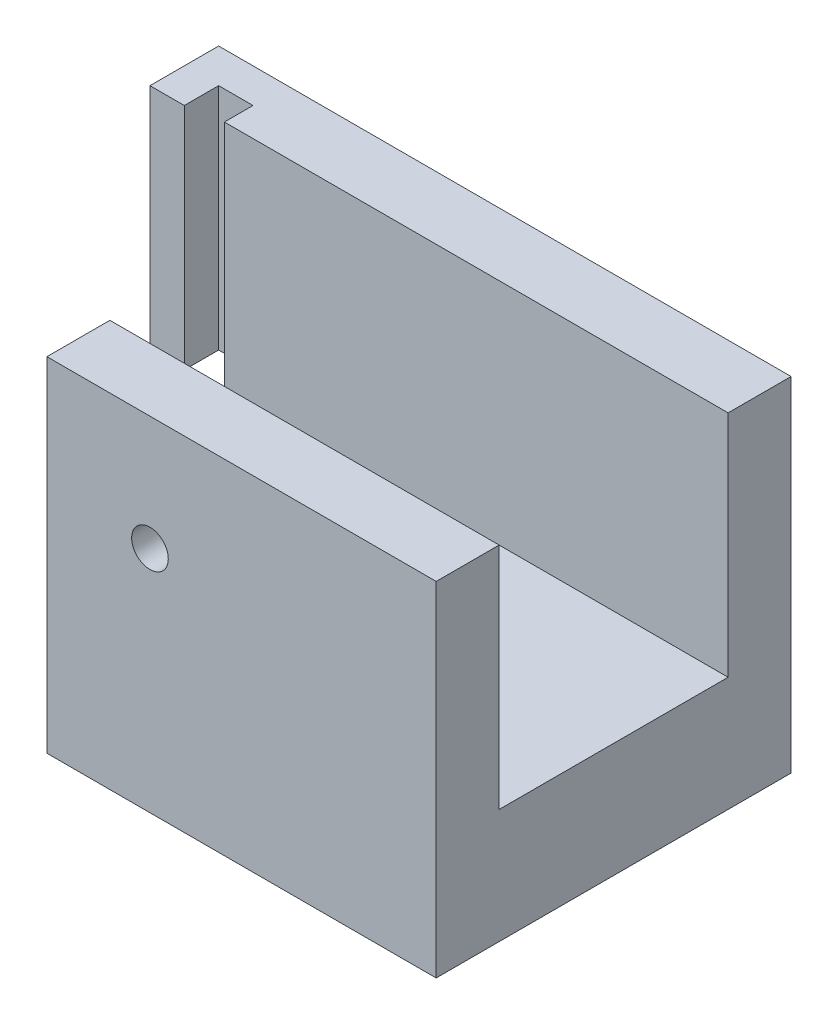
ISO-10303-21;
HEADER;
FILE_DESCRIPTION(('STEP AP214'),'2;1');
FILE_NAME('part.step','',(''),(''),'','','');
FILE_SCHEMA(('AUTOMOTIVE_DESIGN { 1 0 10303 214 1 1 1 1 }'));
ENDSEC;
DATA;
#1=APPLICATION_CONTEXT('core data for automotive mechanical design processes');
#2=APPLICATION_PROTOCOL_DEFINITION('international standard','automotive_design',2000,#1);
#3=PRODUCT_CONTEXT('',#1,'mechanical');
#4=PRODUCT('Part','Part','',(#3));
#5=PRODUCT_RELATED_PRODUCT_CATEGORY('part','',(#4));
#6=PRODUCT_DEFINITION_FORMATION('','',#4);
#7=PRODUCT_DEFINITION_CONTEXT('part definition',#1,'design');
#8=PRODUCT_DEFINITION('design','',#6,#7);
#9=PRODUCT_DEFINITION_SHAPE('','',#8);
#10=(LENGTH_UNIT() NAMED_UNIT(*) SI_UNIT(.MILLI.,.METRE.));
#11=(NAMED_UNIT(*) PLANE_ANGLE_UNIT() SI_UNIT($,.RADIAN.));
#12=(NAMED_UNIT(*) SI_UNIT($,.STERADIAN.) SOLID_ANGLE_UNIT());
#13=UNCERTAINTY_MEASURE_WITH_UNIT(LENGTH_MEASURE(1.E-05),#10,'distance_accuracy_value','');
#14=(GEOMETRIC_REPRESENTATION_CONTEXT(3) GLOBAL_UNCERTAINTY_ASSIGNED_CONTEXT((#13)) GLOBAL_UNIT_ASSIGNED_CONTEXT((#10,
#11,#12)) REPRESENTATION_CONTEXT('',''));
#15=CARTESIAN_POINT('',(0.,0.,0.));
#16=DIRECTION('',(0.,0.,1.));
#17=DIRECTION('',(1.,0.,0.));
#18=AXIS2_PLACEMENT_3D('',#15,#16,#17);
#19=CARTESIAN_POINT('',(0.,15.,-11.936414520975));
#20=DIRECTION('',(1.,0.,0.));
#21=DIRECTION('',(0.,0.,-1.));
#22=AXIS2_PLACEMENT_3D('',#19,#20,#21);
#23=PLANE('',#22);
#24=DIRECTION('',(0.,0.,1.));
#25=VECTOR('',#24,1.);
#26=CARTESIAN_POINT('',(0.,5.,-11.936414520975));
#27=LINE('',#26,#25);
#28=CARTESIAN_POINT('',(0.,5.,-11.936414520975));
#29=VERTEX_POINT('',#28);
#30=CARTESIAN_POINT('',(0.,5.,-8.93641452097499));
#31=VERTEX_POINT('',#30);
#32=EDGE_CURVE('E177',#29,#31,#27,.T.);
#33=ORIENTED_EDGE('',*,*,#32,.T.);
#34=DIRECTION('',(0.,-1.,0.));
#35=VECTOR('',#34,1.);
#36=CARTESIAN_POINT('',(0.,15.,-8.93641452097499));
#37=LINE('',#36,#35);
#38=CARTESIAN_POINT('',(0.,15.,-8.93641452097499));
#39=VERTEX_POINT('',#38);
#40=EDGE_CURVE('E53',#39,#31,#37,.T.);
#41=ORIENTED_EDGE('',*,*,#40,.F.);
#42=DIRECTION('',(0.,0.,1.));
#43=VECTOR('',#42,1.);
#44=CARTESIAN_POINT('',(0.,15.,-11.936414520975));
#45=LINE('',#44,#43);
#46=CARTESIAN_POINT('',(0.,15.,-11.936414520975));
#47=VERTEX_POINT('',#46);
#48=EDGE_CURVE('E229',#47,#39,#45,.T.);
#49=ORIENTED_EDGE('',*,*,#48,.F.);
#50=DIRECTION('',(0.,-1.,0.));
#51=VECTOR('',#50,1.);
#52=CARTESIAN_POINT('',(0.,15.,-11.936414520975));
#53=LINE('',#52,#51);
#54=EDGE_CURVE('E258',#47,#29,#53,.T.);
#55=ORIENTED_EDGE('',*,*,#54,.T.);
#56=EDGE_LOOP('',(#33,#41,#49,#55));
#57=FACE_BOUND('',#56,.T.);
#58=ADVANCED_FACE('F45',(#57),#23,.F.);
#59=CARTESIAN_POINT('',(0.,15.,-8.93641452097499));
#60=DIRECTION('',(0.,0.,-1.));
#61=DIRECTION('',(-1.,0.,0.));
#62=AXIS2_PLACEMENT_3D('',#59,#60,#61);
#63=PLANE('',#62);
#64=DIRECTION('',(-1.,0.,0.));
#65=VECTOR('',#64,1.);
#66=CARTESIAN_POINT('',(0.,5.,-8.93641452097499));
#67=LINE('',#66,#65);
#68=CARTESIAN_POINT('',(1.5,5.,-8.93641452097499));
#69=VERTEX_POINT('',#68);
#70=EDGE_CURVE('E193',#69,#31,#67,.T.);
#71=ORIENTED_EDGE('',*,*,#70,.F.);
#72=DIRECTION('',(0.,-1.,0.));
#73=VECTOR('',#72,1.);
#74=CARTESIAN_POINT('',(1.5,15.,-8.93641452097499));
#75=LINE('',#74,#73);
#76=CARTESIAN_POINT('',(1.5,15.,-8.93641452097499));
#77=VERTEX_POINT('',#76);
#78=EDGE_CURVE('E288',#77,#69,#75,.T.);
#79=ORIENTED_EDGE('',*,*,#78,.F.);
#80=DIRECTION('',(1.,0.,0.));
#81=VECTOR('',#80,1.);
#82=CARTESIAN_POINT('',(0.,15.,-8.93641452097499));
#83=LINE('',#82,#81);
#84=EDGE_CURVE('E233',#39,#77,#83,.T.);
#85=ORIENTED_EDGE('',*,*,#84,.F.);
#86=ORIENTED_EDGE('',*,*,#40,.T.);
#87=EDGE_LOOP('',(#71,#79,#85,#86));
#88=FACE_BOUND('',#87,.T.);
#89=ADVANCED_FACE('F296',(#88),#63,.F.);
#90=CARTESIAN_POINT('',(1.5,15.,-10.436414520975));
#91=DIRECTION('',(-1.,0.,0.));
#92=DIRECTION('',(0.,0.,1.));
#93=AXIS2_PLACEMENT_3D('',#90,#91,#92);
#94=PLANE('',#93);
#95=DIRECTION('',(0.,0.,1.));
#96=VECTOR('',#95,1.);
#97=CARTESIAN_POINT('',(1.5,5.,-10.436414520975));
#98=LINE('',#97,#96);
#99=CARTESIAN_POINT('',(1.5,5.,-10.436414520975));
#100=VERTEX_POINT('',#99);
#101=EDGE_CURVE('E190',#100,#69,#98,.T.);
#102=ORIENTED_EDGE('',*,*,#101,.F.);
#103=DIRECTION('',(0.,-1.,0.));
#104=VECTOR('',#103,1.);
#105=CARTESIAN_POINT('',(1.5,15.,-10.436414520975));
#106=LINE('',#105,#104);
#107=CARTESIAN_POINT('',(1.5,15.,-10.436414520975));
#108=VERTEX_POINT('',#107);
#109=EDGE_CURVE('E284',#108,#100,#106,.T.);
#110=ORIENTED_EDGE('',*,*,#109,.F.);
#111=DIRECTION('',(0.,0.,-1.));
#112=VECTOR('',#111,1.);
#113=CARTESIAN_POINT('',(1.5,15.,-10.436414520975));
#114=LINE('',#113,#112);
#115=EDGE_CURVE('E237',#77,#108,#114,.T.);
#116=ORIENTED_EDGE('',*,*,#115,.F.);
#117=ORIENTED_EDGE('',*,*,#78,.T.);
#118=EDGE_LOOP('',(#102,#110,#116,#117));
#119=FACE_BOUND('',#118,.T.);
#120=ADVANCED_FACE('F320',(#119),#94,.F.);
#121=CARTESIAN_POINT('',(1.5,15.,-10.436414520975));
#122=DIRECTION('',(0.,0.,-1.));
#123=DIRECTION('',(-1.,0.,0.));
#124=AXIS2_PLACEMENT_3D('',#121,#122,#123);
#125=PLANE('',#124);
#126=DIRECTION('',(-1.,0.,0.));
#127=VECTOR('',#126,1.);
#128=CARTESIAN_POINT('',(1.5,5.,-10.436414520975));
#129=LINE('',#128,#127);
#130=CARTESIAN_POINT('',(3.,5.,-10.436414520975));
#131=VERTEX_POINT('',#130);
#132=EDGE_CURVE('E187',#131,#100,#129,.T.);
#133=ORIENTED_EDGE('',*,*,#132,.F.);
#134=DIRECTION('',(0.,-1.,0.));
#135=VECTOR('',#134,1.);
#136=CARTESIAN_POINT('',(3.,15.,-10.436414520975));
#137=LINE('',#136,#135);
#138=CARTESIAN_POINT('',(3.,15.,-10.436414520975));
#139=VERTEX_POINT('',#138);
#140=EDGE_CURVE('E280',#139,#131,#137,.T.);
#141=ORIENTED_EDGE('',*,*,#140,.F.);
#142=DIRECTION('',(1.,0.,0.));
#143=VECTOR('',#142,1.);
#144=CARTESIAN_POINT('',(1.5,15.,-10.436414520975));
#145=LINE('',#144,#143);
#146=EDGE_CURVE('E240',#108,#139,#145,.T.);
#147=ORIENTED_EDGE('',*,*,#146,.F.);
#148=ORIENTED_EDGE('',*,*,#109,.T.);
#149=EDGE_LOOP('',(#133,#141,#147,#148));
#150=FACE_BOUND('',#149,.T.);
#151=ADVANCED_FACE('F315',(#150),#125,.F.);
#152=CARTESIAN_POINT('',(0.,15.,3.56358547902502));
#153=DIRECTION('',(0.,0.,-1.));
#154=DIRECTION('',(-1.,0.,0.));
#155=AXIS2_PLACEMENT_3D('',#152,#153,#154);
#156=PLANE('',#155);
#157=DIRECTION('',(1.,0.,0.));
#158=VECTOR('',#157,1.);
#159=CARTESIAN_POINT('',(0.,15.,3.56358547902502));
#160=LINE('',#159,#158);
#161=CARTESIAN_POINT('',(8.,15.,3.56358547902502));
#162=VERTEX_POINT('',#161);
#163=CARTESIAN_POINT('',(25.,15.,3.56358547902502));
#164=VERTEX_POINT('',#163);
#165=EDGE_CURVE('E247',#162,#164,#160,.T.);
#166=ORIENTED_EDGE('',*,*,#165,.F.);
#167=DIRECTION('',(0.,1.,0.));
#168=VECTOR('',#167,1.);
#169=CARTESIAN_POINT('',(8.,0.,3.56358547902502));
#170=LINE('',#169,#168);
#171=CARTESIAN_POINT('',(8.,0.,3.56358547902502));
#172=VERTEX_POINT('',#171);
#173=EDGE_CURVE('E161',#172,#162,#170,.T.);
#174=ORIENTED_EDGE('',*,*,#173,.F.);
#175=DIRECTION('',(1.,0.,0.));
#176=VECTOR('',#175,1.);
#177=CARTESIAN_POINT('',(0.,0.,3.56358547902502));
#178=LINE('',#177,#176);
#179=CARTESIAN_POINT('',(25.,0.,3.56358547902502));
#180=VERTEX_POINT('',#179);
#181=EDGE_CURVE('E166',#172,#180,#178,.T.);
#182=ORIENTED_EDGE('',*,*,#181,.T.);
#183=DIRECTION('',(0.,-1.,0.));
#184=VECTOR('',#183,1.);
#185=CARTESIAN_POINT('',(25.,15.,3.56358547902502));
#186=LINE('',#185,#184);
#187=EDGE_CURVE('E276',#164,#180,#186,.T.);
#188=ORIENTED_EDGE('',*,*,#187,.F.);
#189=EDGE_LOOP('',(#166,#174,#182,#188));
#190=FACE_BOUND('',#189,.T.);
#191=CARTESIAN_POINT('',(12.5,10.,3.56358547902502));
#192=DIRECTION('',(0.,0.,1.));
#193=DIRECTION('',(1.,0.,0.));
#194=AXIS2_PLACEMENT_3D('',#191,#192,#193);
#195=CIRCLE('',#194,0.799999999999988);
#196=CARTESIAN_POINT('',(13.3,10.,3.56358547902502));
#197=VERTEX_POINT('',#196);
#198=EDGE_CURVE('E196',#197,#197,#195,.T.);
#199=ORIENTED_EDGE('',*,*,#198,.F.);
#200=EDGE_LOOP('',(#199));
#201=FACE_BOUND('',#200,.T.);
#202=ADVANCED_FACE('F333',(#190,#201),#156,.F.);
#203=CARTESIAN_POINT('',(0.,15.,0.));
#204=DIRECTION('',(0.,1.,0.));
#205=DIRECTION('',(0.,0.,1.));
#206=AXIS2_PLACEMENT_3D('',#203,#204,#205);
#207=PLANE('',#206);
#208=DIRECTION('',(0.,0.,1.));
#209=VECTOR('',#208,1.);
#210=CARTESIAN_POINT('',(8.,15.,-24.9978028218169));
#211=LINE('',#210,#209);
#212=CARTESIAN_POINT('',(8.,15.,0.81358547902502));
#213=VERTEX_POINT('',#212);
#214=EDGE_CURVE('E154',#213,#162,#211,.T.);
#215=ORIENTED_EDGE('',*,*,#214,.T.);
#216=ORIENTED_EDGE('',*,*,#165,.T.);
#217=DIRECTION('',(0.,0.,-1.));
#218=VECTOR('',#217,1.);
#219=CARTESIAN_POINT('',(25.,15.,-11.936414520975));
#220=LINE('',#219,#218);
#221=CARTESIAN_POINT('',(25.,15.,0.813585479025009));
#222=VERTEX_POINT('',#221);
#223=EDGE_CURVE('E251',#164,#222,#220,.T.);
#224=ORIENTED_EDGE('',*,*,#223,.T.);
#225=DIRECTION('',(1.,0.,0.));
#226=VECTOR('',#225,1.);
#227=CARTESIAN_POINT('',(25.,15.,0.813585479025009));
#228=LINE('',#227,#226);
#229=EDGE_CURVE('E210',#213,#222,#228,.T.);
#230=ORIENTED_EDGE('',*,*,#229,.F.);
#231=EDGE_LOOP('',(#215,#216,#224,#230));
#232=FACE_BOUND('',#231,.T.);
#233=ADVANCED_FACE('F340',(#232),#207,.T.);
#234=CARTESIAN_POINT('',(3.,15.,-10.436414520975));
#235=DIRECTION('',(1.,0.,0.));
#236=DIRECTION('',(0.,0.,-1.));
#237=AXIS2_PLACEMENT_3D('',#234,#235,#236);
#238=PLANE('',#237);
#239=DIRECTION('',(0.,0.,1.));
#240=VECTOR('',#239,1.);
#241=CARTESIAN_POINT('',(3.,0.,-10.436414520975));
#242=LINE('',#241,#240);
#243=CARTESIAN_POINT('',(3.,0.,-11.936414520975));
#244=VERTEX_POINT('',#243);
#245=CARTESIAN_POINT('',(3.,0.,-9.18641452097499));
#246=VERTEX_POINT('',#245);
#247=EDGE_CURVE('E67',#244,#246,#242,.T.);
#248=ORIENTED_EDGE('',*,*,#247,.T.);
#249=DIRECTION('',(0.,1.,0.));
#250=VECTOR('',#249,1.);
#251=CARTESIAN_POINT('',(3.,5.,-9.18641452097499));
#252=LINE('',#251,#250);
#253=CARTESIAN_POINT('',(3.,15.,-9.18641452097499));
#254=VERTEX_POINT('',#253);
#255=EDGE_CURVE('E159',#246,#254,#252,.T.);
#256=ORIENTED_EDGE('',*,*,#255,.T.);
#257=DIRECTION('',(0.,0.,1.));
#258=VECTOR('',#257,1.);
#259=CARTESIAN_POINT('',(3.,15.,-10.436414520975));
#260=LINE('',#259,#258);
#261=EDGE_CURVE('E243',#139,#254,#260,.T.);
#262=ORIENTED_EDGE('',*,*,#261,.F.);
#263=ORIENTED_EDGE('',*,*,#140,.T.);
#264=DIRECTION('',(0.,0.,-1.));
#265=VECTOR('',#264,1.);
#266=CARTESIAN_POINT('',(3.,5.,-11.936414520975));
#267=LINE('',#266,#265);
#268=CARTESIAN_POINT('',(3.,5.,-11.936414520975));
#269=VERTEX_POINT('',#268);
#270=EDGE_CURVE('E174',#131,#269,#267,.T.);
#271=ORIENTED_EDGE('',*,*,#270,.T.);
#272=DIRECTION('',(0.,-1.,0.));
#273=VECTOR('',#272,1.);
#274=CARTESIAN_POINT('',(3.,20.7876534038469,-11.936414520975));
#275=LINE('',#274,#273);
#276=EDGE_CURVE('E173',#269,#244,#275,.T.);
#277=ORIENTED_EDGE('',*,*,#276,.T.);
#278=EDGE_LOOP('',(#248,#256,#262,#263,#271,#277));
#279=FACE_BOUND('',#278,.T.);
#280=ADVANCED_FACE('F309',(#279),#238,.F.);
#281=CARTESIAN_POINT('',(25.,15.,-11.936414520975));
#282=DIRECTION('',(-1.,0.,0.));
#283=DIRECTION('',(0.,0.,1.));
#284=AXIS2_PLACEMENT_3D('',#281,#282,#283);
#285=PLANE('',#284);
#286=DIRECTION('',(0.,0.,-1.));
#287=VECTOR('',#286,1.);
#288=CARTESIAN_POINT('',(25.,5.,-9.18641452097499));
#289=LINE('',#288,#287);
#290=CARTESIAN_POINT('',(25.,5.,0.813585479025009));
#291=VERTEX_POINT('',#290);
#292=CARTESIAN_POINT('',(25.,5.,-9.18641452097499));
#293=VERTEX_POINT('',#292);
#294=EDGE_CURVE('E205',#291,#293,#289,.T.);
#295=ORIENTED_EDGE('',*,*,#294,.F.);
#296=DIRECTION('',(0.,1.,0.));
#297=VECTOR('',#296,1.);
#298=CARTESIAN_POINT('',(25.,5.,0.813585479025009));
#299=LINE('',#298,#297);
#300=EDGE_CURVE('E221',#291,#222,#299,.T.);
#301=ORIENTED_EDGE('',*,*,#300,.T.);
#302=ORIENTED_EDGE('',*,*,#223,.F.);
#303=ORIENTED_EDGE('',*,*,#187,.T.);
#304=DIRECTION('',(0.,0.,-1.));
#305=VECTOR('',#304,1.);
#306=CARTESIAN_POINT('',(25.,0.,-11.936414520975));
#307=LINE('',#306,#305);
#308=CARTESIAN_POINT('',(25.,0.,-11.936414520975));
#309=VERTEX_POINT('',#308);
#310=EDGE_CURVE('E263',#180,#309,#307,.T.);
#311=ORIENTED_EDGE('',*,*,#310,.T.);
#312=DIRECTION('',(0.,-1.,0.));
#313=VECTOR('',#312,1.);
#314=CARTESIAN_POINT('',(25.,15.,-11.936414520975));
#315=LINE('',#314,#313);
#316=CARTESIAN_POINT('',(25.,15.,-11.936414520975));
#317=VERTEX_POINT('',#316);
#318=EDGE_CURVE('E272',#317,#309,#315,.T.);
#319=ORIENTED_EDGE('',*,*,#318,.F.);
#320=CARTESIAN_POINT('',(25.,15.,-9.18641452097499));
#321=VERTEX_POINT('',#320);
#322=EDGE_CURVE('E250',#321,#317,#220,.T.);
#323=ORIENTED_EDGE('',*,*,#322,.F.);
#324=DIRECTION('',(0.,1.,0.));
#325=VECTOR('',#324,1.);
#326=CARTESIAN_POINT('',(25.,5.,-9.18641452097499));
#327=LINE('',#326,#325);
#328=EDGE_CURVE('E216',#293,#321,#327,.T.);
#329=ORIENTED_EDGE('',*,*,#328,.F.);
#330=EDGE_LOOP('',(#295,#301,#302,#303,#311,#319,#323,#329));
#331=FACE_BOUND('',#330,.T.);
#332=ADVANCED_FACE('F328',(#331),#285,.F.);
#333=CARTESIAN_POINT('',(0.,15.,-11.936414520975));
#334=DIRECTION('',(0.,0.,1.));
#335=DIRECTION('',(1.,0.,0.));
#336=AXIS2_PLACEMENT_3D('',#333,#334,#335);
#337=PLANE('',#336);
#338=DIRECTION('',(-1.,0.,0.));
#339=VECTOR('',#338,1.);
#340=CARTESIAN_POINT('',(0.,0.,-11.936414520975));
#341=LINE('',#340,#339);
#342=EDGE_CURVE('E234',#309,#244,#341,.T.);
#343=ORIENTED_EDGE('',*,*,#342,.T.);
#344=ORIENTED_EDGE('',*,*,#276,.F.);
#345=DIRECTION('',(-1.,0.,0.));
#346=VECTOR('',#345,1.);
#347=CARTESIAN_POINT('',(0.,5.,-11.936414520975));
#348=LINE('',#347,#346);
#349=EDGE_CURVE('E181',#269,#29,#348,.T.);
#350=ORIENTED_EDGE('',*,*,#349,.T.);
#351=ORIENTED_EDGE('',*,*,#54,.F.);
#352=DIRECTION('',(-1.,0.,0.));
#353=VECTOR('',#352,1.);
#354=CARTESIAN_POINT('',(0.,15.,-11.936414520975));
#355=LINE('',#354,#353);
#356=EDGE_CURVE('E255',#317,#47,#355,.T.);
#357=ORIENTED_EDGE('',*,*,#356,.F.);
#358=ORIENTED_EDGE('',*,*,#318,.T.);
#359=EDGE_LOOP('',(#343,#344,#350,#351,#357,#358));
#360=FACE_BOUND('',#359,.T.);
#361=ADVANCED_FACE('F306',(#360),#337,.F.);
#362=DIRECTION('',(-1.,0.,0.));
#363=VECTOR('',#362,1.);
#364=CARTESIAN_POINT('',(25.,15.,-9.18641452097499));
#365=LINE('',#364,#363);
#366=EDGE_CURVE('E204',#321,#254,#365,.T.);
#367=ORIENTED_EDGE('',*,*,#366,.F.);
#368=ORIENTED_EDGE('',*,*,#322,.T.);
#369=ORIENTED_EDGE('',*,*,#356,.T.);
#370=ORIENTED_EDGE('',*,*,#48,.T.);
#371=ORIENTED_EDGE('',*,*,#84,.T.);
#372=ORIENTED_EDGE('',*,*,#115,.T.);
#373=ORIENTED_EDGE('',*,*,#146,.T.);
#374=ORIENTED_EDGE('',*,*,#261,.T.);
#375=EDGE_LOOP('',(#367,#368,#369,#370,#371,#372,#373,#374));
#376=FACE_BOUND('',#375,.T.);
#377=ADVANCED_FACE('F323',(#376),#207,.T.);
#378=CARTESIAN_POINT('',(0.,0.,0.));
#379=DIRECTION('',(0.,1.,0.));
#380=DIRECTION('',(0.,0.,1.));
#381=AXIS2_PLACEMENT_3D('',#378,#379,#380);
#382=PLANE('',#381);
#383=DIRECTION('',(0.,0.,1.));
#384=VECTOR('',#383,1.);
#385=CARTESIAN_POINT('',(8.,0.,-24.9978028218169));
#386=LINE('',#385,#384);
#387=CARTESIAN_POINT('',(8.,0.,-9.18641452097499));
#388=VERTEX_POINT('',#387);
#389=EDGE_CURVE('E149',#388,#172,#386,.T.);
#390=ORIENTED_EDGE('',*,*,#389,.F.);
#391=DIRECTION('',(1.,0.,0.));
#392=VECTOR('',#391,1.);
#393=CARTESIAN_POINT('',(3.00000000000001,0.,-9.18641452097499));
#394=LINE('',#393,#392);
#395=EDGE_CURVE('E156',#246,#388,#394,.T.);
#396=ORIENTED_EDGE('',*,*,#395,.F.);
#397=ORIENTED_EDGE('',*,*,#247,.F.);
#398=ORIENTED_EDGE('',*,*,#342,.F.);
#399=ORIENTED_EDGE('',*,*,#310,.F.);
#400=ORIENTED_EDGE('',*,*,#181,.F.);
#401=EDGE_LOOP('',(#390,#396,#397,#398,#399,#400));
#402=FACE_BOUND('',#401,.T.);
#403=ADVANCED_FACE('F164',(#402),#382,.F.);
#404=CARTESIAN_POINT('',(25.,5.,0.813585479025009));
#405=DIRECTION('',(0.,0.,1.));
#406=DIRECTION('',(1.,0.,0.));
#407=AXIS2_PLACEMENT_3D('',#404,#405,#406);
#408=PLANE('',#407);
#409=CARTESIAN_POINT('',(12.5,10.,0.813585479025015));
#410=DIRECTION('',(0.,0.,1.));
#411=DIRECTION('',(1.,0.,0.));
#412=AXIS2_PLACEMENT_3D('',#409,#410,#411);
#413=CIRCLE('',#412,0.799999999999993);
#414=CARTESIAN_POINT('',(13.3,10.,0.813585479025015));
#415=VERTEX_POINT('',#414);
#416=EDGE_CURVE('E200',#415,#415,#413,.T.);
#417=ORIENTED_EDGE('',*,*,#416,.T.);
#418=EDGE_LOOP('',(#417));
#419=FACE_BOUND('',#418,.T.);
#420=DIRECTION('',(1.,0.,0.));
#421=VECTOR('',#420,1.);
#422=CARTESIAN_POINT('',(25.,5.,0.813585479025009));
#423=LINE('',#422,#421);
#424=CARTESIAN_POINT('',(8.,5.,0.813585479025018));
#425=VERTEX_POINT('',#424);
#426=EDGE_CURVE('E213',#425,#291,#423,.T.);
#427=ORIENTED_EDGE('',*,*,#426,.F.);
#428=DIRECTION('',(0.,1.,0.));
#429=VECTOR('',#428,1.);
#430=CARTESIAN_POINT('',(8.,5.,0.813585479025018));
#431=LINE('',#430,#429);
#432=EDGE_CURVE('E60',#425,#213,#431,.T.);
#433=ORIENTED_EDGE('',*,*,#432,.T.);
#434=ORIENTED_EDGE('',*,*,#229,.T.);
#435=ORIENTED_EDGE('',*,*,#300,.F.);
#436=EDGE_LOOP('',(#427,#433,#434,#435));
#437=FACE_BOUND('',#436,.T.);
#438=ADVANCED_FACE('F346',(#419,#437),#408,.F.);
#439=CARTESIAN_POINT('',(25.,5.,-9.18641452097499));
#440=DIRECTION('',(0.,0.,-1.));
#441=DIRECTION('',(-1.,0.,0.));
#442=AXIS2_PLACEMENT_3D('',#439,#440,#441);
#443=PLANE('',#442);
#444=ORIENTED_EDGE('',*,*,#366,.T.);
#445=ORIENTED_EDGE('',*,*,#255,.F.);
#446=ORIENTED_EDGE('',*,*,#395,.T.);
#447=DIRECTION('',(0.,1.,0.));
#448=VECTOR('',#447,1.);
#449=CARTESIAN_POINT('',(8.,0.,-9.18641452097499));
#450=LINE('',#449,#448);
#451=CARTESIAN_POINT('',(8.,5.,-9.18641452097499));
#452=VERTEX_POINT('',#451);
#453=EDGE_CURVE('E145',#388,#452,#450,.T.);
#454=ORIENTED_EDGE('',*,*,#453,.T.);
#455=DIRECTION('',(-1.,0.,0.));
#456=VECTOR('',#455,1.);
#457=CARTESIAN_POINT('',(25.,5.,-9.18641452097499));
#458=LINE('',#457,#456);
#459=EDGE_CURVE('E209',#293,#452,#458,.T.);
#460=ORIENTED_EDGE('',*,*,#459,.F.);
#461=ORIENTED_EDGE('',*,*,#328,.T.);
#462=EDGE_LOOP('',(#444,#445,#446,#454,#460,#461));
#463=FACE_BOUND('',#462,.T.);
#464=ADVANCED_FACE('F157',(#463),#443,.F.);
#465=CARTESIAN_POINT('',(0.,5.,0.));
#466=DIRECTION('',(0.,-1.,0.));
#467=DIRECTION('',(0.,0.,-1.));
#468=AXIS2_PLACEMENT_3D('',#465,#466,#467);
#469=PLANE('',#468);
#470=ORIENTED_EDGE('',*,*,#459,.T.);
#471=DIRECTION('',(0.,0.,1.));
#472=VECTOR('',#471,1.);
#473=CARTESIAN_POINT('',(8.,5.,0.));
#474=LINE('',#473,#472);
#475=EDGE_CURVE('E11',#452,#425,#474,.T.);
#476=ORIENTED_EDGE('',*,*,#475,.T.);
#477=ORIENTED_EDGE('',*,*,#426,.T.);
#478=ORIENTED_EDGE('',*,*,#294,.T.);
#479=EDGE_LOOP('',(#470,#476,#477,#478));
#480=FACE_BOUND('',#479,.T.);
#481=ADVANCED_FACE('F349',(#480),#469,.F.);
#482=CARTESIAN_POINT('',(12.5,10.,3.56358547902502));
#483=DIRECTION('',(0.,0.,1.));
#484=DIRECTION('',(1.,0.,0.));
#485=AXIS2_PLACEMENT_3D('',#482,#483,#484);
#486=CYLINDRICAL_SURFACE('',#485,0.799999999999993);
#487=ORIENTED_EDGE('',*,*,#416,.F.);
#488=EDGE_LOOP('',(#487));
#489=FACE_BOUND('',#488,.T.);
#490=ORIENTED_EDGE('',*,*,#198,.T.);
#491=EDGE_LOOP('',(#490));
#492=FACE_BOUND('',#491,.T.);
#493=ADVANCED_FACE('F351',(#489,#492),#486,.F.);
#494=CARTESIAN_POINT('',(0.,5.,0.));
#495=DIRECTION('',(0.,-1.,0.));
#496=DIRECTION('',(0.,0.,-1.));
#497=AXIS2_PLACEMENT_3D('',#494,#495,#496);
#498=PLANE('',#497);
#499=ORIENTED_EDGE('',*,*,#70,.T.);
#500=ORIENTED_EDGE('',*,*,#32,.F.);
#501=ORIENTED_EDGE('',*,*,#349,.F.);
#502=ORIENTED_EDGE('',*,*,#270,.F.);
#503=ORIENTED_EDGE('',*,*,#132,.T.);
#504=ORIENTED_EDGE('',*,*,#101,.T.);
#505=EDGE_LOOP('',(#499,#500,#501,#502,#503,#504));
#506=FACE_BOUND('',#505,.T.);
#507=ADVANCED_FACE('F303',(#506),#498,.T.);
#508=CARTESIAN_POINT('',(8.,0.,-24.9978028218169));
#509=DIRECTION('',(1.,0.,0.));
#510=DIRECTION('',(0.,0.,-1.));
#511=AXIS2_PLACEMENT_3D('',#508,#509,#510);
#512=PLANE('',#511);
#513=ORIENTED_EDGE('',*,*,#475,.F.);
#514=ORIENTED_EDGE('',*,*,#453,.F.);
#515=ORIENTED_EDGE('',*,*,#389,.T.);
#516=ORIENTED_EDGE('',*,*,#173,.T.);
#517=ORIENTED_EDGE('',*,*,#214,.F.);
#518=ORIENTED_EDGE('',*,*,#432,.F.);
#519=EDGE_LOOP('',(#513,#514,#515,#516,#517,#518));
#520=FACE_BOUND('',#519,.T.);
#521=ADVANCED_FACE('F147',(#520),#512,.F.);
#522=CLOSED_SHELL('',(#58,#89,#120,#151,#202,#233,#280,#332,#361,#377,#403,#438,#464,#481,#493,
#507,#521));
#523=MANIFOLD_SOLID_BREP('B2',#522);
#524=ADVANCED_BREP_SHAPE_REPRESENTATION('',(#18,#523),#14);
#525=SHAPE_DEFINITION_REPRESENTATION(#9,#524);
ENDSEC;
END-ISO-10303-21;
